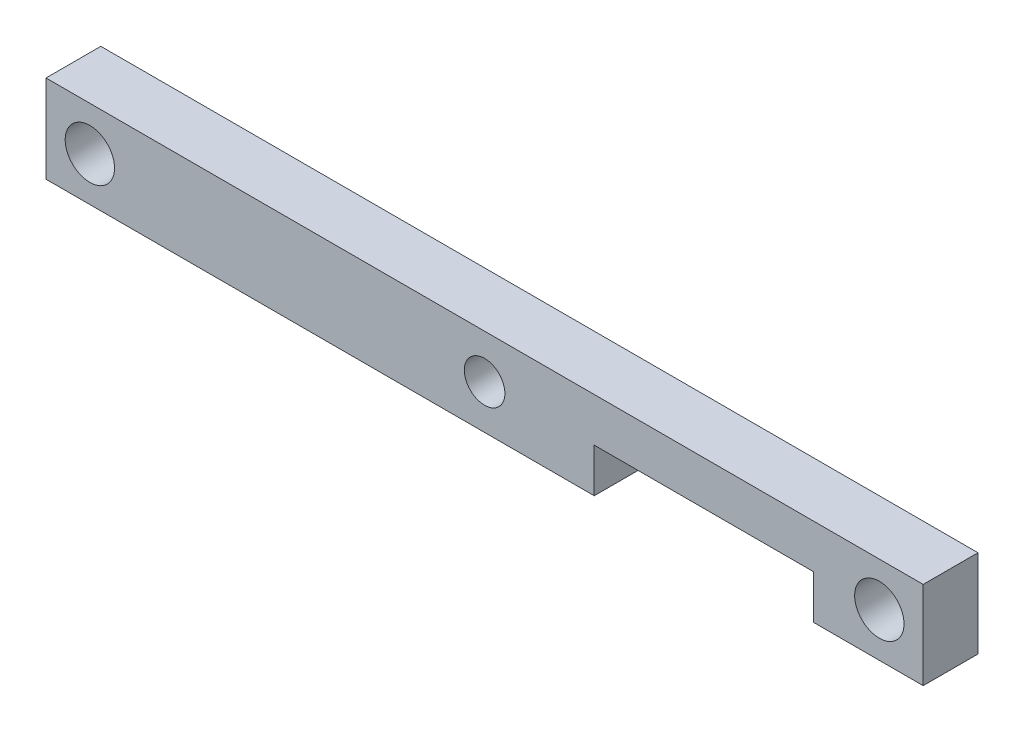
ISO-10303-21;
HEADER;
FILE_DESCRIPTION(('STEP AP214'),'2;1');
FILE_NAME('part.step','',(''),(''),'','','');
FILE_SCHEMA(('AUTOMOTIVE_DESIGN { 1 0 10303 214 1 1 1 1 }'));
ENDSEC;
DATA;
#1=APPLICATION_CONTEXT('core data for automotive mechanical design processes');
#2=APPLICATION_PROTOCOL_DEFINITION('international standard','automotive_design',2000,#1);
#3=PRODUCT_CONTEXT('',#1,'mechanical');
#4=PRODUCT('Part','Part','',(#3));
#5=PRODUCT_RELATED_PRODUCT_CATEGORY('part','',(#4));
#6=PRODUCT_DEFINITION_FORMATION('','',#4);
#7=PRODUCT_DEFINITION_CONTEXT('part definition',#1,'design');
#8=PRODUCT_DEFINITION('design','',#6,#7);
#9=PRODUCT_DEFINITION_SHAPE('','',#8);
#10=(LENGTH_UNIT() NAMED_UNIT(*) SI_UNIT(.MILLI.,.METRE.));
#11=(NAMED_UNIT(*) PLANE_ANGLE_UNIT() SI_UNIT($,.RADIAN.));
#12=(NAMED_UNIT(*) SI_UNIT($,.STERADIAN.) SOLID_ANGLE_UNIT());
#13=UNCERTAINTY_MEASURE_WITH_UNIT(LENGTH_MEASURE(1.E-05),#10,'distance_accuracy_value','');
#14=(GEOMETRIC_REPRESENTATION_CONTEXT(3) GLOBAL_UNCERTAINTY_ASSIGNED_CONTEXT((#13)) GLOBAL_UNIT_ASSIGNED_CONTEXT((#10,
#11,#12)) REPRESENTATION_CONTEXT('',''));
#15=CARTESIAN_POINT('',(0.,0.,0.));
#16=DIRECTION('',(0.,0.,1.));
#17=DIRECTION('',(1.,0.,0.));
#18=AXIS2_PLACEMENT_3D('',#15,#16,#17);
#19=CARTESIAN_POINT('',(-40.,-4.,5.));
#20=DIRECTION('',(0.,1.,0.));
#21=DIRECTION('',(0.,0.,1.));
#22=AXIS2_PLACEMENT_3D('',#19,#20,#21);
#23=PLANE('',#22);
#24=DIRECTION('',(1.,0.,0.));
#25=VECTOR('',#24,1.);
#26=CARTESIAN_POINT('',(-40.,-4.,0.));
#27=LINE('',#26,#25);
#28=CARTESIAN_POINT('',(-40.,-4.,0.));
#29=VERTEX_POINT('',#28);
#30=CARTESIAN_POINT('',(10.,-4.,0.));
#31=VERTEX_POINT('',#30);
#32=EDGE_CURVE('E119',#29,#31,#27,.T.);
#33=ORIENTED_EDGE('',*,*,#32,.T.);
#34=DIRECTION('',(0.,0.,1.));
#35=VECTOR('',#34,1.);
#36=CARTESIAN_POINT('',(10.,-4.,5.));
#37=LINE('',#36,#35);
#38=CARTESIAN_POINT('',(10.,-4.,5.));
#39=VERTEX_POINT('',#38);
#40=EDGE_CURVE('E41',#31,#39,#37,.T.);
#41=ORIENTED_EDGE('',*,*,#40,.T.);
#42=DIRECTION('',(1.,0.,0.));
#43=VECTOR('',#42,1.);
#44=CARTESIAN_POINT('',(-40.,-4.,5.));
#45=LINE('',#44,#43);
#46=CARTESIAN_POINT('',(-40.,-4.,5.));
#47=VERTEX_POINT('',#46);
#48=EDGE_CURVE('E86',#47,#39,#45,.T.);
#49=ORIENTED_EDGE('',*,*,#48,.F.);
#50=DIRECTION('',(0.,0.,-1.));
#51=VECTOR('',#50,1.);
#52=CARTESIAN_POINT('',(-40.,-4.,5.));
#53=LINE('',#52,#51);
#54=EDGE_CURVE('E150',#47,#29,#53,.T.);
#55=ORIENTED_EDGE('',*,*,#54,.T.);
#56=EDGE_LOOP('',(#33,#41,#49,#55));
#57=FACE_BOUND('',#56,.T.);
#58=ADVANCED_FACE('F33',(#57),#23,.F.);
#59=CARTESIAN_POINT('',(0.,0.,5.));
#60=DIRECTION('',(0.,0.,1.));
#61=DIRECTION('',(1.,0.,0.));
#62=AXIS2_PLACEMENT_3D('',#59,#60,#61);
#63=PLANE('',#62);
#64=DIRECTION('',(0.,-1.,0.));
#65=VECTOR('',#64,1.);
#66=CARTESIAN_POINT('',(10.,-4.,5.));
#67=LINE('',#66,#65);
#68=CARTESIAN_POINT('',(10.,0.,5.));
#69=VERTEX_POINT('',#68);
#70=EDGE_CURVE('E109',#69,#39,#67,.T.);
#71=ORIENTED_EDGE('',*,*,#70,.F.);
#72=DIRECTION('',(-1.,0.,0.));
#73=VECTOR('',#72,1.);
#74=CARTESIAN_POINT('',(10.,0.,5.));
#75=LINE('',#74,#73);
#76=CARTESIAN_POINT('',(30.,0.,5.));
#77=VERTEX_POINT('',#76);
#78=EDGE_CURVE('E304',#77,#69,#75,.T.);
#79=ORIENTED_EDGE('',*,*,#78,.F.);
#80=DIRECTION('',(0.,1.,0.));
#81=VECTOR('',#80,1.);
#82=CARTESIAN_POINT('',(30.,-4.,5.));
#83=LINE('',#82,#81);
#84=CARTESIAN_POINT('',(30.,-4.,5.));
#85=VERTEX_POINT('',#84);
#86=EDGE_CURVE('E116',#85,#77,#83,.T.);
#87=ORIENTED_EDGE('',*,*,#86,.F.);
#88=CARTESIAN_POINT('',(40.,-4.,5.));
#89=VERTEX_POINT('',#88);
#90=EDGE_CURVE('E127',#85,#89,#45,.T.);
#91=ORIENTED_EDGE('',*,*,#90,.T.);
#92=DIRECTION('',(0.,1.,0.));
#93=VECTOR('',#92,1.);
#94=CARTESIAN_POINT('',(40.,4.,5.));
#95=LINE('',#94,#93);
#96=CARTESIAN_POINT('',(40.,4.,5.));
#97=VERTEX_POINT('',#96);
#98=EDGE_CURVE('E126',#89,#97,#95,.T.);
#99=ORIENTED_EDGE('',*,*,#98,.T.);
#100=DIRECTION('',(-1.,0.,0.));
#101=VECTOR('',#100,1.);
#102=CARTESIAN_POINT('',(-40.,4.,5.));
#103=LINE('',#102,#101);
#104=CARTESIAN_POINT('',(-40.,4.,5.));
#105=VERTEX_POINT('',#104);
#106=EDGE_CURVE('E57',#97,#105,#103,.T.);
#107=ORIENTED_EDGE('',*,*,#106,.T.);
#108=DIRECTION('',(0.,-1.,0.));
#109=VECTOR('',#108,1.);
#110=CARTESIAN_POINT('',(-40.,4.,5.));
#111=LINE('',#110,#109);
#112=EDGE_CURVE('E124',#105,#47,#111,.T.);
#113=ORIENTED_EDGE('',*,*,#112,.T.);
#114=ORIENTED_EDGE('',*,*,#48,.T.);
#115=EDGE_LOOP('',(#71,#79,#87,#91,#99,#107,#113,#114));
#116=FACE_BOUND('',#115,.T.);
#117=CARTESIAN_POINT('',(0.,0.,5.));
#118=DIRECTION('',(0.,0.,1.));
#119=DIRECTION('',(1.,0.,0.));
#120=AXIS2_PLACEMENT_3D('',#117,#118,#119);
#121=CIRCLE('',#120,1.85);
#122=CARTESIAN_POINT('',(1.85,0.,5.));
#123=VERTEX_POINT('',#122);
#124=EDGE_CURVE('E182',#123,#123,#121,.T.);
#125=ORIENTED_EDGE('',*,*,#124,.F.);
#126=EDGE_LOOP('',(#125));
#127=FACE_BOUND('',#126,.T.);
#128=CARTESIAN_POINT('',(-36.,0.,5.));
#129=DIRECTION('',(0.,0.,1.));
#130=DIRECTION('',(1.,0.,0.));
#131=AXIS2_PLACEMENT_3D('',#128,#129,#130);
#132=CIRCLE('',#131,2.25);
#133=CARTESIAN_POINT('',(-33.75,0.,5.));
#134=VERTEX_POINT('',#133);
#135=EDGE_CURVE('E139',#134,#134,#132,.T.);
#136=ORIENTED_EDGE('',*,*,#135,.F.);
#137=EDGE_LOOP('',(#136));
#138=FACE_BOUND('',#137,.T.);
#139=CARTESIAN_POINT('',(36.,0.,5.));
#140=DIRECTION('',(0.,0.,1.));
#141=DIRECTION('',(1.,0.,0.));
#142=AXIS2_PLACEMENT_3D('',#139,#140,#141);
#143=CIRCLE('',#142,2.25);
#144=CARTESIAN_POINT('',(38.25,0.,5.));
#145=VERTEX_POINT('',#144);
#146=EDGE_CURVE('E174',#145,#145,#143,.T.);
#147=ORIENTED_EDGE('',*,*,#146,.F.);
#148=EDGE_LOOP('',(#147));
#149=FACE_BOUND('',#148,.T.);
#150=ADVANCED_FACE('F121',(#116,#127,#138,#149),#63,.T.);
#151=CARTESIAN_POINT('',(0.,0.,0.));
#152=DIRECTION('',(0.,0.,1.));
#153=DIRECTION('',(1.,0.,0.));
#154=AXIS2_PLACEMENT_3D('',#151,#152,#153);
#155=PLANE('',#154);
#156=DIRECTION('',(-1.,0.,0.));
#157=VECTOR('',#156,1.);
#158=CARTESIAN_POINT('',(0.,0.,0.));
#159=LINE('',#158,#157);
#160=CARTESIAN_POINT('',(30.,0.,0.));
#161=VERTEX_POINT('',#160);
#162=CARTESIAN_POINT('',(10.,0.,0.));
#163=VERTEX_POINT('',#162);
#164=EDGE_CURVE('E11',#161,#163,#159,.T.);
#165=ORIENTED_EDGE('',*,*,#164,.T.);
#166=DIRECTION('',(0.,-1.,0.));
#167=VECTOR('',#166,1.);
#168=CARTESIAN_POINT('',(10.,0.,0.));
#169=LINE('',#168,#167);
#170=EDGE_CURVE('E170',#163,#31,#169,.T.);
#171=ORIENTED_EDGE('',*,*,#170,.T.);
#172=ORIENTED_EDGE('',*,*,#32,.F.);
#173=DIRECTION('',(0.,-1.,0.));
#174=VECTOR('',#173,1.);
#175=CARTESIAN_POINT('',(-40.,4.,0.));
#176=LINE('',#175,#174);
#177=CARTESIAN_POINT('',(-40.,4.,0.));
#178=VERTEX_POINT('',#177);
#179=EDGE_CURVE('E135',#178,#29,#176,.T.);
#180=ORIENTED_EDGE('',*,*,#179,.F.);
#181=DIRECTION('',(-1.,0.,0.));
#182=VECTOR('',#181,1.);
#183=CARTESIAN_POINT('',(-40.,4.,0.));
#184=LINE('',#183,#182);
#185=CARTESIAN_POINT('',(40.,4.,0.));
#186=VERTEX_POINT('',#185);
#187=EDGE_CURVE('E78',#186,#178,#184,.T.);
#188=ORIENTED_EDGE('',*,*,#187,.F.);
#189=DIRECTION('',(0.,1.,0.));
#190=VECTOR('',#189,1.);
#191=CARTESIAN_POINT('',(40.,4.,0.));
#192=LINE('',#191,#190);
#193=CARTESIAN_POINT('',(40.,-4.,0.));
#194=VERTEX_POINT('',#193);
#195=EDGE_CURVE('E141',#194,#186,#192,.T.);
#196=ORIENTED_EDGE('',*,*,#195,.F.);
#197=CARTESIAN_POINT('',(30.,-4.,0.));
#198=VERTEX_POINT('',#197);
#199=EDGE_CURVE('E138',#198,#194,#27,.T.);
#200=ORIENTED_EDGE('',*,*,#199,.F.);
#201=DIRECTION('',(0.,1.,0.));
#202=VECTOR('',#201,1.);
#203=CARTESIAN_POINT('',(30.,0.,0.));
#204=LINE('',#203,#202);
#205=EDGE_CURVE('E48',#198,#161,#204,.T.);
#206=ORIENTED_EDGE('',*,*,#205,.T.);
#207=EDGE_LOOP('',(#165,#171,#172,#180,#188,#196,#200,#206));
#208=FACE_BOUND('',#207,.T.);
#209=CARTESIAN_POINT('',(-36.,0.,0.));
#210=DIRECTION('',(0.,0.,1.));
#211=DIRECTION('',(1.,0.,0.));
#212=AXIS2_PLACEMENT_3D('',#209,#210,#211);
#213=CIRCLE('',#212,2.25);
#214=CARTESIAN_POINT('',(-33.75,0.,0.));
#215=VERTEX_POINT('',#214);
#216=EDGE_CURVE('E185',#215,#215,#213,.T.);
#217=ORIENTED_EDGE('',*,*,#216,.T.);
#218=EDGE_LOOP('',(#217));
#219=FACE_BOUND('',#218,.T.);
#220=CARTESIAN_POINT('',(0.,0.,0.));
#221=DIRECTION('',(0.,0.,1.));
#222=DIRECTION('',(1.,0.,0.));
#223=AXIS2_PLACEMENT_3D('',#220,#221,#222);
#224=CIRCLE('',#223,1.85);
#225=CARTESIAN_POINT('',(1.85,0.,0.));
#226=VERTEX_POINT('',#225);
#227=EDGE_CURVE('E180',#226,#226,#224,.T.);
#228=ORIENTED_EDGE('',*,*,#227,.T.);
#229=EDGE_LOOP('',(#228));
#230=FACE_BOUND('',#229,.T.);
#231=CARTESIAN_POINT('',(36.,0.,0.));
#232=DIRECTION('',(0.,0.,1.));
#233=DIRECTION('',(1.,0.,0.));
#234=AXIS2_PLACEMENT_3D('',#231,#232,#233);
#235=CIRCLE('',#234,2.25);
#236=CARTESIAN_POINT('',(38.25,0.,0.));
#237=VERTEX_POINT('',#236);
#238=EDGE_CURVE('E171',#237,#237,#235,.T.);
#239=ORIENTED_EDGE('',*,*,#238,.T.);
#240=EDGE_LOOP('',(#239));
#241=FACE_BOUND('',#240,.T.);
#242=ADVANCED_FACE('F161',(#208,#219,#230,#241),#155,.F.);
#243=CARTESIAN_POINT('',(-40.,4.,5.));
#244=DIRECTION('',(1.,0.,0.));
#245=DIRECTION('',(0.,0.,-1.));
#246=AXIS2_PLACEMENT_3D('',#243,#244,#245);
#247=PLANE('',#246);
#248=ORIENTED_EDGE('',*,*,#179,.T.);
#249=ORIENTED_EDGE('',*,*,#54,.F.);
#250=ORIENTED_EDGE('',*,*,#112,.F.);
#251=DIRECTION('',(0.,0.,-1.));
#252=VECTOR('',#251,1.);
#253=CARTESIAN_POINT('',(-40.,4.,5.));
#254=LINE('',#253,#252);
#255=EDGE_CURVE('E134',#105,#178,#254,.T.);
#256=ORIENTED_EDGE('',*,*,#255,.T.);
#257=EDGE_LOOP('',(#248,#249,#250,#256));
#258=FACE_BOUND('',#257,.T.);
#259=ADVANCED_FACE('F35',(#258),#247,.F.);
#260=ORIENTED_EDGE('',*,*,#90,.F.);
#261=DIRECTION('',(0.,0.,-1.));
#262=VECTOR('',#261,1.);
#263=CARTESIAN_POINT('',(30.,-4.,5.));
#264=LINE('',#263,#262);
#265=EDGE_CURVE('E120',#85,#198,#264,.T.);
#266=ORIENTED_EDGE('',*,*,#265,.T.);
#267=ORIENTED_EDGE('',*,*,#199,.T.);
#268=DIRECTION('',(0.,0.,-1.));
#269=VECTOR('',#268,1.);
#270=CARTESIAN_POINT('',(40.,-4.,5.));
#271=LINE('',#270,#269);
#272=EDGE_CURVE('E147',#89,#194,#271,.T.);
#273=ORIENTED_EDGE('',*,*,#272,.F.);
#274=EDGE_LOOP('',(#260,#266,#267,#273));
#275=FACE_BOUND('',#274,.T.);
#276=ADVANCED_FACE('F155',(#275),#23,.F.);
#277=CARTESIAN_POINT('',(40.,4.,5.));
#278=DIRECTION('',(-1.,0.,0.));
#279=DIRECTION('',(0.,0.,1.));
#280=AXIS2_PLACEMENT_3D('',#277,#278,#279);
#281=PLANE('',#280);
#282=ORIENTED_EDGE('',*,*,#195,.T.);
#283=DIRECTION('',(0.,0.,-1.));
#284=VECTOR('',#283,1.);
#285=CARTESIAN_POINT('',(40.,4.,5.));
#286=LINE('',#285,#284);
#287=EDGE_CURVE('E145',#97,#186,#286,.T.);
#288=ORIENTED_EDGE('',*,*,#287,.F.);
#289=ORIENTED_EDGE('',*,*,#98,.F.);
#290=ORIENTED_EDGE('',*,*,#272,.T.);
#291=EDGE_LOOP('',(#282,#288,#289,#290));
#292=FACE_BOUND('',#291,.T.);
#293=ADVANCED_FACE('F166',(#292),#281,.F.);
#294=CARTESIAN_POINT('',(-40.,4.,5.));
#295=DIRECTION('',(0.,-1.,0.));
#296=DIRECTION('',(0.,0.,-1.));
#297=AXIS2_PLACEMENT_3D('',#294,#295,#296);
#298=PLANE('',#297);
#299=ORIENTED_EDGE('',*,*,#187,.T.);
#300=ORIENTED_EDGE('',*,*,#255,.F.);
#301=ORIENTED_EDGE('',*,*,#106,.F.);
#302=ORIENTED_EDGE('',*,*,#287,.T.);
#303=EDGE_LOOP('',(#299,#300,#301,#302));
#304=FACE_BOUND('',#303,.T.);
#305=ADVANCED_FACE('F168',(#304),#298,.F.);
#306=CARTESIAN_POINT('',(-36.,0.,5.));
#307=DIRECTION('',(0.,0.,-1.));
#308=DIRECTION('',(-1.,0.,0.));
#309=AXIS2_PLACEMENT_3D('',#306,#307,#308);
#310=CYLINDRICAL_SURFACE('',#309,2.25);
#311=ORIENTED_EDGE('',*,*,#135,.T.);
#312=EDGE_LOOP('',(#311));
#313=FACE_BOUND('',#312,.T.);
#314=ORIENTED_EDGE('',*,*,#216,.F.);
#315=EDGE_LOOP('',(#314));
#316=FACE_BOUND('',#315,.T.);
#317=ADVANCED_FACE('F193',(#313,#316),#310,.F.);
#318=CARTESIAN_POINT('',(0.,0.,5.));
#319=DIRECTION('',(0.,0.,-1.));
#320=DIRECTION('',(-1.,0.,0.));
#321=AXIS2_PLACEMENT_3D('',#318,#319,#320);
#322=CYLINDRICAL_SURFACE('',#321,1.85);
#323=ORIENTED_EDGE('',*,*,#124,.T.);
#324=EDGE_LOOP('',(#323));
#325=FACE_BOUND('',#324,.T.);
#326=ORIENTED_EDGE('',*,*,#227,.F.);
#327=EDGE_LOOP('',(#326));
#328=FACE_BOUND('',#327,.T.);
#329=ADVANCED_FACE('F195',(#325,#328),#322,.F.);
#330=CARTESIAN_POINT('',(36.,0.,5.));
#331=DIRECTION('',(0.,0.,-1.));
#332=DIRECTION('',(-1.,0.,0.));
#333=AXIS2_PLACEMENT_3D('',#330,#331,#332);
#334=CYLINDRICAL_SURFACE('',#333,2.25);
#335=ORIENTED_EDGE('',*,*,#146,.T.);
#336=EDGE_LOOP('',(#335));
#337=FACE_BOUND('',#336,.T.);
#338=ORIENTED_EDGE('',*,*,#238,.F.);
#339=EDGE_LOOP('',(#338));
#340=FACE_BOUND('',#339,.T.);
#341=ADVANCED_FACE('F202',(#337,#340),#334,.F.);
#342=CARTESIAN_POINT('',(10.,0.,-3.));
#343=DIRECTION('',(0.,1.,0.));
#344=DIRECTION('',(0.,0.,1.));
#345=AXIS2_PLACEMENT_3D('',#342,#343,#344);
#346=PLANE('',#345);
#347=DIRECTION('',(0.,0.,1.));
#348=VECTOR('',#347,1.);
#349=CARTESIAN_POINT('',(30.,0.,-3.));
#350=LINE('',#349,#348);
#351=EDGE_CURVE('E303',#161,#77,#350,.T.);
#352=ORIENTED_EDGE('',*,*,#351,.T.);
#353=ORIENTED_EDGE('',*,*,#78,.T.);
#354=DIRECTION('',(0.,0.,1.));
#355=VECTOR('',#354,1.);
#356=CARTESIAN_POINT('',(10.,0.,-3.));
#357=LINE('',#356,#355);
#358=EDGE_CURVE('E113',#163,#69,#357,.T.);
#359=ORIENTED_EDGE('',*,*,#358,.F.);
#360=ORIENTED_EDGE('',*,*,#164,.F.);
#361=EDGE_LOOP('',(#352,#353,#359,#360));
#362=FACE_BOUND('',#361,.T.);
#363=ADVANCED_FACE('F241',(#362),#346,.F.);
#364=CARTESIAN_POINT('',(10.,-4.,-3.));
#365=DIRECTION('',(-1.,0.,0.));
#366=DIRECTION('',(0.,-1.,0.));
#367=AXIS2_PLACEMENT_3D('',#364,#365,#366);
#368=PLANE('',#367);
#369=ORIENTED_EDGE('',*,*,#358,.T.);
#370=ORIENTED_EDGE('',*,*,#70,.T.);
#371=ORIENTED_EDGE('',*,*,#40,.F.);
#372=ORIENTED_EDGE('',*,*,#170,.F.);
#373=EDGE_LOOP('',(#369,#370,#371,#372));
#374=FACE_BOUND('',#373,.T.);
#375=ADVANCED_FACE('F110',(#374),#368,.F.);
#376=CARTESIAN_POINT('',(30.,-4.,-3.));
#377=DIRECTION('',(1.,0.,0.));
#378=DIRECTION('',(0.,0.,-1.));
#379=AXIS2_PLACEMENT_3D('',#376,#377,#378);
#380=PLANE('',#379);
#381=ORIENTED_EDGE('',*,*,#265,.F.);
#382=ORIENTED_EDGE('',*,*,#86,.T.);
#383=ORIENTED_EDGE('',*,*,#351,.F.);
#384=ORIENTED_EDGE('',*,*,#205,.F.);
#385=EDGE_LOOP('',(#381,#382,#383,#384));
#386=FACE_BOUND('',#385,.T.);
#387=ADVANCED_FACE('F291',(#386),#380,.F.);
#388=CLOSED_SHELL('',(#58,#150,#242,#259,#276,#293,#305,#317,#329,#341,#363,#375,#387));
#389=MANIFOLD_SOLID_BREP('B2',#388);
#390=ADVANCED_BREP_SHAPE_REPRESENTATION('',(#18,#389),#14);
#391=SHAPE_DEFINITION_REPRESENTATION(#9,#390);
ENDSEC;
END-ISO-10303-21;
